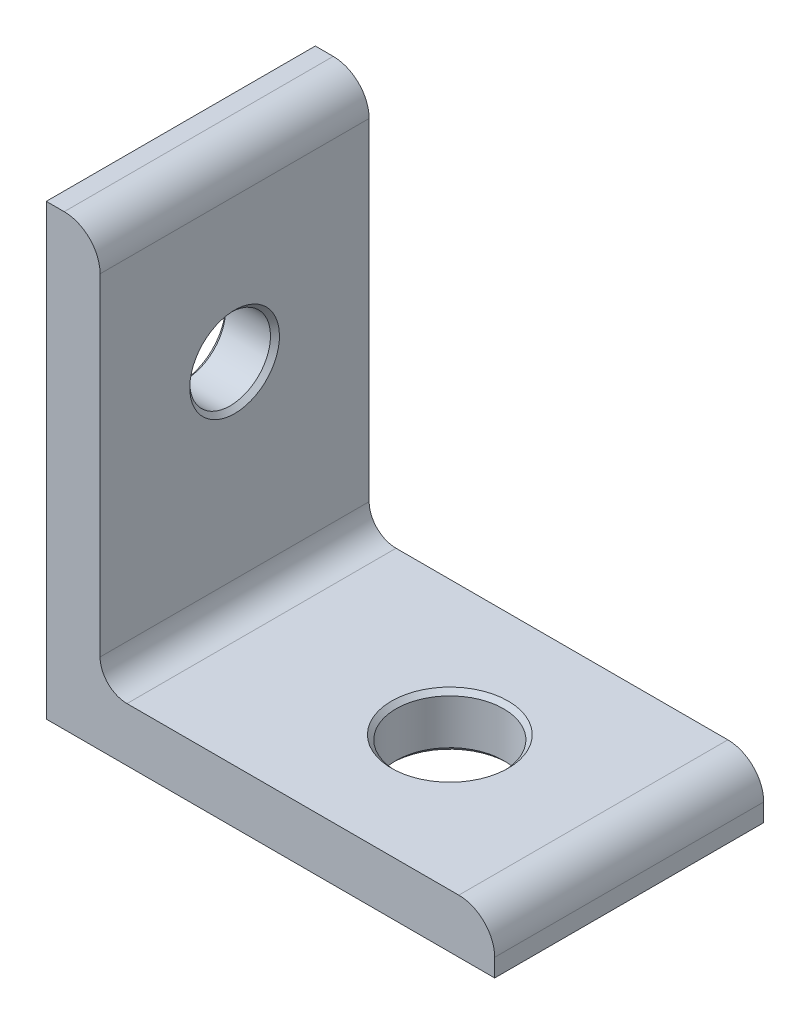
ISO-10303-21;
HEADER;
FILE_DESCRIPTION(('STEP AP214'),'2;1');
FILE_NAME('part.step','',(''),(''),'','','');
FILE_SCHEMA(('AUTOMOTIVE_DESIGN { 1 0 10303 214 1 1 1 1 }'));
ENDSEC;
DATA;
#1=APPLICATION_CONTEXT('core data for automotive mechanical design processes');
#2=APPLICATION_PROTOCOL_DEFINITION('international standard','automotive_design',2000,#1);
#3=PRODUCT_CONTEXT('',#1,'mechanical');
#4=PRODUCT('Part','Part','',(#3));
#5=PRODUCT_RELATED_PRODUCT_CATEGORY('part','',(#4));
#6=PRODUCT_DEFINITION_FORMATION('','',#4);
#7=PRODUCT_DEFINITION_CONTEXT('part definition',#1,'design');
#8=PRODUCT_DEFINITION('design','',#6,#7);
#9=PRODUCT_DEFINITION_SHAPE('','',#8);
#10=(LENGTH_UNIT() NAMED_UNIT(*) SI_UNIT(.MILLI.,.METRE.));
#11=(NAMED_UNIT(*) PLANE_ANGLE_UNIT() SI_UNIT($,.RADIAN.));
#12=(NAMED_UNIT(*) SI_UNIT($,.STERADIAN.) SOLID_ANGLE_UNIT());
#13=UNCERTAINTY_MEASURE_WITH_UNIT(LENGTH_MEASURE(1.E-05),#10,'distance_accuracy_value','');
#14=(GEOMETRIC_REPRESENTATION_CONTEXT(3) GLOBAL_UNCERTAINTY_ASSIGNED_CONTEXT((#13)) GLOBAL_UNIT_ASSIGNED_CONTEXT((#10,
#11,#12)) REPRESENTATION_CONTEXT('',''));
#15=CARTESIAN_POINT('',(0.,0.,0.));
#16=DIRECTION('',(0.,0.,1.));
#17=DIRECTION('',(1.,0.,0.));
#18=AXIS2_PLACEMENT_3D('',#15,#16,#17);
#19=CARTESIAN_POINT('',(0.,0.,-9.5));
#20=DIRECTION('',(0.,-1.,0.));
#21=DIRECTION('',(1.,0.,0.));
#22=AXIS2_PLACEMENT_3D('',#19,#20,#21);
#23=PLANE('',#22);
#24=CARTESIAN_POINT('',(30.,0.,5.5));
#25=DIRECTION('',(0.,-1.,0.));
#26=DIRECTION('',(1.,0.,0.));
#27=AXIS2_PLACEMENT_3D('',#24,#25,#26);
#28=CIRCLE('',#27,6.5);
#29=CARTESIAN_POINT('',(36.5,0.,5.5));
#30=VERTEX_POINT('',#29);
#31=EDGE_CURVE('E159',#30,#30,#28,.F.);
#32=ORIENTED_EDGE('',*,*,#31,.T.);
#33=EDGE_LOOP('',(#32));
#34=FACE_BOUND('',#33,.T.);
#35=DIRECTION('',(1.,0.,0.));
#36=VECTOR('',#35,1.);
#37=CARTESIAN_POINT('',(0.,0.,20.5));
#38=LINE('',#37,#36);
#39=CARTESIAN_POINT('',(0.,0.,20.5));
#40=VERTEX_POINT('',#39);
#41=CARTESIAN_POINT('',(50.,0.,20.5));
#42=VERTEX_POINT('',#41);
#43=EDGE_CURVE('E136',#40,#42,#38,.T.);
#44=ORIENTED_EDGE('',*,*,#43,.F.);
#45=DIRECTION('',(0.,0.,1.));
#46=VECTOR('',#45,1.);
#47=CARTESIAN_POINT('',(0.,0.,-9.5));
#48=LINE('',#47,#46);
#49=CARTESIAN_POINT('',(0.,0.,-9.5));
#50=VERTEX_POINT('',#49);
#51=EDGE_CURVE('E124',#50,#40,#48,.T.);
#52=ORIENTED_EDGE('',*,*,#51,.F.);
#53=DIRECTION('',(1.,0.,0.));
#54=VECTOR('',#53,1.);
#55=CARTESIAN_POINT('',(0.,0.,-9.5));
#56=LINE('',#55,#54);
#57=CARTESIAN_POINT('',(50.,0.,-9.5));
#58=VERTEX_POINT('',#57);
#59=EDGE_CURVE('E120',#50,#58,#56,.T.);
#60=ORIENTED_EDGE('',*,*,#59,.T.);
#61=DIRECTION('',(0.,0.,1.));
#62=VECTOR('',#61,1.);
#63=CARTESIAN_POINT('',(50.,0.,-9.5));
#64=LINE('',#63,#62);
#65=EDGE_CURVE('E104',#58,#42,#64,.T.);
#66=ORIENTED_EDGE('',*,*,#65,.T.);
#67=EDGE_LOOP('',(#44,#52,#60,#66));
#68=FACE_BOUND('',#67,.T.);
#69=ADVANCED_FACE('F34',(#34,#68),#23,.T.);
#70=CARTESIAN_POINT('',(0.,50.,-9.5));
#71=DIRECTION('',(-1.,0.,0.));
#72=DIRECTION('',(0.,0.,1.));
#73=AXIS2_PLACEMENT_3D('',#70,#71,#72);
#74=PLANE('',#73);
#75=CARTESIAN_POINT('',(0.,30.,5.5));
#76=DIRECTION('',(-1.,0.,0.));
#77=DIRECTION('',(0.,0.,1.));
#78=AXIS2_PLACEMENT_3D('',#75,#76,#77);
#79=CIRCLE('',#78,4.99999999999996);
#80=CARTESIAN_POINT('',(0.,30.,10.5));
#81=VERTEX_POINT('',#80);
#82=EDGE_CURVE('E147',#81,#81,#79,.F.);
#83=ORIENTED_EDGE('',*,*,#82,.T.);
#84=EDGE_LOOP('',(#83));
#85=FACE_BOUND('',#84,.T.);
#86=DIRECTION('',(0.,-1.,0.));
#87=VECTOR('',#86,1.);
#88=CARTESIAN_POINT('',(0.,50.,20.5));
#89=LINE('',#88,#87);
#90=CARTESIAN_POINT('',(0.,50.,20.5));
#91=VERTEX_POINT('',#90);
#92=EDGE_CURVE('E125',#91,#40,#89,.T.);
#93=ORIENTED_EDGE('',*,*,#92,.F.);
#94=DIRECTION('',(0.,0.,1.));
#95=VECTOR('',#94,1.);
#96=CARTESIAN_POINT('',(0.,50.,-9.5));
#97=LINE('',#96,#95);
#98=CARTESIAN_POINT('',(0.,50.,-9.5));
#99=VERTEX_POINT('',#98);
#100=EDGE_CURVE('E113',#99,#91,#97,.T.);
#101=ORIENTED_EDGE('',*,*,#100,.F.);
#102=DIRECTION('',(0.,-1.,0.));
#103=VECTOR('',#102,1.);
#104=CARTESIAN_POINT('',(0.,50.,-9.5));
#105=LINE('',#104,#103);
#106=EDGE_CURVE('E114',#99,#50,#105,.T.);
#107=ORIENTED_EDGE('',*,*,#106,.T.);
#108=ORIENTED_EDGE('',*,*,#51,.T.);
#109=EDGE_LOOP('',(#93,#101,#107,#108));
#110=FACE_BOUND('',#109,.T.);
#111=ADVANCED_FACE('F220',(#85,#110),#74,.T.);
#112=CARTESIAN_POINT('',(50.,50.,-9.5));
#113=DIRECTION('',(0.,1.,0.));
#114=DIRECTION('',(0.,0.,1.));
#115=AXIS2_PLACEMENT_3D('',#112,#113,#114);
#116=PLANE('',#115);
#117=DIRECTION('',(-1.,0.,0.));
#118=VECTOR('',#117,1.);
#119=CARTESIAN_POINT('',(50.,50.,20.5));
#120=LINE('',#119,#118);
#121=CARTESIAN_POINT('',(1.99999997999942,50.,20.5));
#122=VERTEX_POINT('',#121);
#123=EDGE_CURVE('E128',#122,#91,#120,.T.);
#124=ORIENTED_EDGE('',*,*,#123,.F.);
#125=DIRECTION('',(0.,0.,1.));
#126=VECTOR('',#125,1.);
#127=CARTESIAN_POINT('',(1.99999997999943,50.,-9.5));
#128=LINE('',#127,#126);
#129=CARTESIAN_POINT('',(1.99999997999942,50.,-9.5));
#130=VERTEX_POINT('',#129);
#131=EDGE_CURVE('E188',#122,#130,#128,.F.);
#132=ORIENTED_EDGE('',*,*,#131,.T.);
#133=DIRECTION('',(-1.,0.,0.));
#134=VECTOR('',#133,1.);
#135=CARTESIAN_POINT('',(50.,50.,-9.5));
#136=LINE('',#135,#134);
#137=EDGE_CURVE('E122',#130,#99,#136,.T.);
#138=ORIENTED_EDGE('',*,*,#137,.T.);
#139=ORIENTED_EDGE('',*,*,#100,.T.);
#140=EDGE_LOOP('',(#124,#132,#138,#139));
#141=FACE_BOUND('',#140,.T.);
#142=ADVANCED_FACE('F226',(#141),#116,.T.);
#143=CARTESIAN_POINT('',(50.,0.,-9.5));
#144=DIRECTION('',(1.,0.,0.));
#145=DIRECTION('',(0.,0.,-1.));
#146=AXIS2_PLACEMENT_3D('',#143,#144,#145);
#147=PLANE('',#146);
#148=DIRECTION('',(0.,1.,0.));
#149=VECTOR('',#148,1.);
#150=CARTESIAN_POINT('',(50.,0.,-9.5));
#151=LINE('',#150,#149);
#152=CARTESIAN_POINT('',(50.,1.99999997999943,-9.5));
#153=VERTEX_POINT('',#152);
#154=EDGE_CURVE('E106',#58,#153,#151,.T.);
#155=ORIENTED_EDGE('',*,*,#154,.T.);
#156=DIRECTION('',(0.,0.,-1.));
#157=VECTOR('',#156,1.);
#158=CARTESIAN_POINT('',(50.,1.99999997999943,20.5));
#159=LINE('',#158,#157);
#160=CARTESIAN_POINT('',(50.,1.99999997999943,20.5));
#161=VERTEX_POINT('',#160);
#162=EDGE_CURVE('E11',#153,#161,#159,.F.);
#163=ORIENTED_EDGE('',*,*,#162,.T.);
#164=DIRECTION('',(0.,1.,0.));
#165=VECTOR('',#164,1.);
#166=CARTESIAN_POINT('',(50.,0.,20.5));
#167=LINE('',#166,#165);
#168=EDGE_CURVE('E108',#42,#161,#167,.T.);
#169=ORIENTED_EDGE('',*,*,#168,.F.);
#170=ORIENTED_EDGE('',*,*,#65,.F.);
#171=EDGE_LOOP('',(#155,#163,#169,#170));
#172=FACE_BOUND('',#171,.T.);
#173=ADVANCED_FACE('F105',(#172),#147,.T.);
#174=CARTESIAN_POINT('',(0.,0.,-9.5));
#175=DIRECTION('',(0.,0.,1.));
#176=DIRECTION('',(1.,0.,0.));
#177=AXIS2_PLACEMENT_3D('',#174,#175,#176);
#178=PLANE('',#177);
#179=ORIENTED_EDGE('',*,*,#137,.F.);
#180=CARTESIAN_POINT('',(1.99999997999943,45.9999999799994,-9.5));
#181=DIRECTION('',(0.,0.,1.));
#182=DIRECTION('',(1.,0.,0.));
#183=AXIS2_PLACEMENT_3D('',#180,#181,#182);
#184=CIRCLE('',#183,4.00000002000058);
#185=CARTESIAN_POINT('',(6.,45.9999999799994,-9.5));
#186=VERTEX_POINT('',#185);
#187=EDGE_CURVE('E191',#130,#186,#184,.F.);
#188=ORIENTED_EDGE('',*,*,#187,.T.);
#189=DIRECTION('',(0.,1.,0.));
#190=VECTOR('',#189,1.);
#191=CARTESIAN_POINT('',(6.,6.,-9.5));
#192=LINE('',#191,#190);
#193=CARTESIAN_POINT('',(6.,9.00000000000015,-9.5));
#194=VERTEX_POINT('',#193);
#195=EDGE_CURVE('E131',#194,#186,#192,.T.);
#196=ORIENTED_EDGE('',*,*,#195,.F.);
#197=CARTESIAN_POINT('',(9.00000000000015,9.00000000000015,-9.5));
#198=DIRECTION('',(0.,0.,1.));
#199=DIRECTION('',(1.,0.,0.));
#200=AXIS2_PLACEMENT_3D('',#197,#198,#199);
#201=CIRCLE('',#200,3.00000000000015);
#202=CARTESIAN_POINT('',(9.00000000000015,6.,-9.5));
#203=VERTEX_POINT('',#202);
#204=EDGE_CURVE('E176',#194,#203,#201,.T.);
#205=ORIENTED_EDGE('',*,*,#204,.T.);
#206=DIRECTION('',(-1.,0.,0.));
#207=VECTOR('',#206,1.);
#208=CARTESIAN_POINT('',(90.,6.,-9.5));
#209=LINE('',#208,#207);
#210=CARTESIAN_POINT('',(45.9999999799994,6.,-9.5));
#211=VERTEX_POINT('',#210);
#212=EDGE_CURVE('E194',#211,#203,#209,.T.);
#213=ORIENTED_EDGE('',*,*,#212,.F.);
#214=CARTESIAN_POINT('',(45.9999999799994,1.99999997999943,-9.5));
#215=DIRECTION('',(0.,0.,1.));
#216=DIRECTION('',(1.,0.,0.));
#217=AXIS2_PLACEMENT_3D('',#214,#215,#216);
#218=CIRCLE('',#217,4.00000002000058);
#219=EDGE_CURVE('E49',#211,#153,#218,.F.);
#220=ORIENTED_EDGE('',*,*,#219,.T.);
#221=ORIENTED_EDGE('',*,*,#154,.F.);
#222=ORIENTED_EDGE('',*,*,#59,.F.);
#223=ORIENTED_EDGE('',*,*,#106,.F.);
#224=EDGE_LOOP('',(#179,#188,#196,#205,#213,#220,#221,#222,#223));
#225=FACE_BOUND('',#224,.T.);
#226=ADVANCED_FACE('F118',(#225),#178,.F.);
#227=CARTESIAN_POINT('',(0.,0.,20.5));
#228=DIRECTION('',(0.,0.,1.));
#229=DIRECTION('',(1.,0.,0.));
#230=AXIS2_PLACEMENT_3D('',#227,#228,#229);
#231=PLANE('',#230);
#232=DIRECTION('',(0.,1.,0.));
#233=VECTOR('',#232,1.);
#234=CARTESIAN_POINT('',(6.,6.,20.5));
#235=LINE('',#234,#233);
#236=CARTESIAN_POINT('',(6.,9.00000000000015,20.5));
#237=VERTEX_POINT('',#236);
#238=CARTESIAN_POINT('',(6.,45.9999999799994,20.5));
#239=VERTEX_POINT('',#238);
#240=EDGE_CURVE('E138',#237,#239,#235,.T.);
#241=ORIENTED_EDGE('',*,*,#240,.T.);
#242=CARTESIAN_POINT('',(1.99999997999943,45.9999999799994,20.5));
#243=DIRECTION('',(0.,0.,1.));
#244=DIRECTION('',(1.,0.,0.));
#245=AXIS2_PLACEMENT_3D('',#242,#243,#244);
#246=CIRCLE('',#245,4.00000002000058);
#247=EDGE_CURVE('E186',#239,#122,#246,.T.);
#248=ORIENTED_EDGE('',*,*,#247,.T.);
#249=ORIENTED_EDGE('',*,*,#123,.T.);
#250=ORIENTED_EDGE('',*,*,#92,.T.);
#251=ORIENTED_EDGE('',*,*,#43,.T.);
#252=ORIENTED_EDGE('',*,*,#168,.T.);
#253=CARTESIAN_POINT('',(45.9999999799994,1.99999997999943,20.5));
#254=DIRECTION('',(0.,0.,1.));
#255=DIRECTION('',(1.,0.,0.));
#256=AXIS2_PLACEMENT_3D('',#253,#254,#255);
#257=CIRCLE('',#256,4.00000002000058);
#258=CARTESIAN_POINT('',(45.9999999799994,6.,20.5));
#259=VERTEX_POINT('',#258);
#260=EDGE_CURVE('E184',#161,#259,#257,.T.);
#261=ORIENTED_EDGE('',*,*,#260,.T.);
#262=DIRECTION('',(1.,0.,0.));
#263=VECTOR('',#262,1.);
#264=CARTESIAN_POINT('',(0.,6.,20.5));
#265=LINE('',#264,#263);
#266=CARTESIAN_POINT('',(9.00000000000015,6.,20.5));
#267=VERTEX_POINT('',#266);
#268=EDGE_CURVE('E142',#267,#259,#265,.T.);
#269=ORIENTED_EDGE('',*,*,#268,.F.);
#270=CARTESIAN_POINT('',(9.00000000000015,9.00000000000015,20.5));
#271=DIRECTION('',(0.,0.,1.));
#272=DIRECTION('',(1.,0.,0.));
#273=AXIS2_PLACEMENT_3D('',#270,#271,#272);
#274=CIRCLE('',#273,3.00000000000015);
#275=EDGE_CURVE('E179',#267,#237,#274,.F.);
#276=ORIENTED_EDGE('',*,*,#275,.T.);
#277=EDGE_LOOP('',(#241,#248,#249,#250,#251,#252,#261,#269,#276));
#278=FACE_BOUND('',#277,.T.);
#279=ADVANCED_FACE('F204',(#278),#231,.T.);
#280=CARTESIAN_POINT('',(90.,6.,20.5));
#281=DIRECTION('',(0.,-1.,0.));
#282=DIRECTION('',(0.,0.,-1.));
#283=AXIS2_PLACEMENT_3D('',#280,#281,#282);
#284=PLANE('',#283);
#285=CARTESIAN_POINT('',(30.,6.,5.5));
#286=DIRECTION('',(0.,-1.,0.));
#287=DIRECTION('',(0.,0.,-1.));
#288=AXIS2_PLACEMENT_3D('',#285,#286,#287);
#289=CIRCLE('',#288,6.49999999999998);
#290=CARTESIAN_POINT('',(30.,6.,-0.999999999999984));
#291=VERTEX_POINT('',#290);
#292=EDGE_CURVE('E168',#291,#291,#289,.T.);
#293=ORIENTED_EDGE('',*,*,#292,.T.);
#294=EDGE_LOOP('',(#293));
#295=FACE_BOUND('',#294,.T.);
#296=ORIENTED_EDGE('',*,*,#268,.T.);
#297=DIRECTION('',(0.,0.,-1.));
#298=VECTOR('',#297,1.);
#299=CARTESIAN_POINT('',(45.9999999799994,6.,-9.5));
#300=LINE('',#299,#298);
#301=EDGE_CURVE('E42',#259,#211,#300,.T.);
#302=ORIENTED_EDGE('',*,*,#301,.T.);
#303=ORIENTED_EDGE('',*,*,#212,.T.);
#304=DIRECTION('',(0.,0.,-1.));
#305=VECTOR('',#304,1.);
#306=CARTESIAN_POINT('',(9.00000000000015,6.,20.5));
#307=LINE('',#306,#305);
#308=EDGE_CURVE('E174',#203,#267,#307,.F.);
#309=ORIENTED_EDGE('',*,*,#308,.T.);
#310=EDGE_LOOP('',(#296,#302,#303,#309));
#311=FACE_BOUND('',#310,.T.);
#312=ADVANCED_FACE('F193',(#295,#311),#284,.F.);
#313=CARTESIAN_POINT('',(6.,6.,20.5));
#314=DIRECTION('',(-1.,0.,0.));
#315=DIRECTION('',(0.,-1.,0.));
#316=AXIS2_PLACEMENT_3D('',#313,#314,#315);
#317=PLANE('',#316);
#318=CARTESIAN_POINT('',(6.,30.,5.5));
#319=DIRECTION('',(-1.,0.,0.));
#320=DIRECTION('',(0.,-1.,0.));
#321=AXIS2_PLACEMENT_3D('',#318,#319,#320);
#322=CIRCLE('',#321,4.99999999999998);
#323=CARTESIAN_POINT('',(6.,25.,5.5));
#324=VERTEX_POINT('',#323);
#325=EDGE_CURVE('E156',#324,#324,#322,.T.);
#326=ORIENTED_EDGE('',*,*,#325,.T.);
#327=EDGE_LOOP('',(#326));
#328=FACE_BOUND('',#327,.T.);
#329=ORIENTED_EDGE('',*,*,#195,.T.);
#330=DIRECTION('',(0.,0.,1.));
#331=VECTOR('',#330,1.);
#332=CARTESIAN_POINT('',(6.,45.9999999799994,20.5));
#333=LINE('',#332,#331);
#334=EDGE_CURVE('E181',#186,#239,#333,.T.);
#335=ORIENTED_EDGE('',*,*,#334,.T.);
#336=ORIENTED_EDGE('',*,*,#240,.F.);
#337=DIRECTION('',(0.,0.,-1.));
#338=VECTOR('',#337,1.);
#339=CARTESIAN_POINT('',(6.,9.00000000000015,-9.5));
#340=LINE('',#339,#338);
#341=EDGE_CURVE('E171',#237,#194,#340,.T.);
#342=ORIENTED_EDGE('',*,*,#341,.T.);
#343=EDGE_LOOP('',(#329,#335,#336,#342));
#344=FACE_BOUND('',#343,.T.);
#345=ADVANCED_FACE('F209',(#328,#344),#317,.F.);
#346=CARTESIAN_POINT('',(30.,6.,5.5));
#347=DIRECTION('',(0.,1.,0.));
#348=DIRECTION('',(0.,0.,1.));
#349=AXIS2_PLACEMENT_3D('',#346,#347,#348);
#350=CYLINDRICAL_SURFACE('',#349,6.);
#351=CARTESIAN_POINT('',(30.,0.500000000000002,5.5));
#352=DIRECTION('',(0.,-1.,0.));
#353=DIRECTION('',(0.,0.,-1.));
#354=AXIS2_PLACEMENT_3D('',#351,#352,#353);
#355=CIRCLE('',#354,6.);
#356=CARTESIAN_POINT('',(30.,0.500000000000002,-0.499999999999997));
#357=VERTEX_POINT('',#356);
#358=EDGE_CURVE('E165',#357,#357,#355,.T.);
#359=ORIENTED_EDGE('',*,*,#358,.T.);
#360=EDGE_LOOP('',(#359));
#361=FACE_BOUND('',#360,.T.);
#362=CARTESIAN_POINT('',(30.,5.50000000000002,5.5));
#363=DIRECTION('',(0.,-1.,0.));
#364=DIRECTION('',(0.,0.,-1.));
#365=AXIS2_PLACEMENT_3D('',#362,#363,#364);
#366=CIRCLE('',#365,6.);
#367=CARTESIAN_POINT('',(30.,5.50000000000002,-0.499999999999997));
#368=VERTEX_POINT('',#367);
#369=EDGE_CURVE('E162',#368,#368,#366,.F.);
#370=ORIENTED_EDGE('',*,*,#369,.T.);
#371=EDGE_LOOP('',(#370));
#372=FACE_BOUND('',#371,.T.);
#373=ADVANCED_FACE('F272',(#361,#372),#350,.F.);
#374=CARTESIAN_POINT('',(6.,30.,5.5));
#375=DIRECTION('',(1.,0.,0.));
#376=DIRECTION('',(0.,0.,-1.));
#377=AXIS2_PLACEMENT_3D('',#374,#375,#376);
#378=CYLINDRICAL_SURFACE('',#377,4.49999999999999);
#379=CARTESIAN_POINT('',(0.49999999999998,30.,5.5));
#380=DIRECTION('',(-1.,0.,0.));
#381=DIRECTION('',(0.,0.,1.));
#382=AXIS2_PLACEMENT_3D('',#379,#380,#381);
#383=CIRCLE('',#382,4.49999999999999);
#384=CARTESIAN_POINT('',(0.49999999999998,30.,9.99999999999999));
#385=VERTEX_POINT('',#384);
#386=EDGE_CURVE('E153',#385,#385,#383,.T.);
#387=ORIENTED_EDGE('',*,*,#386,.T.);
#388=EDGE_LOOP('',(#387));
#389=FACE_BOUND('',#388,.T.);
#390=CARTESIAN_POINT('',(5.50000000000002,30.,5.5));
#391=DIRECTION('',(-1.,0.,0.));
#392=DIRECTION('',(0.,0.,1.));
#393=AXIS2_PLACEMENT_3D('',#390,#391,#392);
#394=CIRCLE('',#393,4.49999999999999);
#395=CARTESIAN_POINT('',(5.50000000000002,30.,9.99999999999999));
#396=VERTEX_POINT('',#395);
#397=EDGE_CURVE('E150',#396,#396,#394,.F.);
#398=ORIENTED_EDGE('',*,*,#397,.T.);
#399=EDGE_LOOP('',(#398));
#400=FACE_BOUND('',#399,.T.);
#401=ADVANCED_FACE('F236',(#389,#400),#378,.F.);
#402=CARTESIAN_POINT('',(0.,30.,5.5));
#403=DIRECTION('',(-1.,0.,0.));
#404=DIRECTION('',(0.,0.,1.));
#405=AXIS2_PLACEMENT_3D('',#402,#403,#404);
#406=CONICAL_SURFACE('',#405,4.99999999999996,0.785398163397445);
#407=ORIENTED_EDGE('',*,*,#386,.F.);
#408=EDGE_LOOP('',(#407));
#409=FACE_BOUND('',#408,.T.);
#410=ORIENTED_EDGE('',*,*,#82,.F.);
#411=EDGE_LOOP('',(#410));
#412=FACE_BOUND('',#411,.T.);
#413=ADVANCED_FACE('F232',(#409,#412),#406,.F.);
#414=CARTESIAN_POINT('',(5.50000000000002,30.,5.5));
#415=DIRECTION('',(1.,0.,0.));
#416=DIRECTION('',(0.,0.,-1.));
#417=AXIS2_PLACEMENT_3D('',#414,#415,#416);
#418=CONICAL_SURFACE('',#417,4.49999999999999,0.785398163397452);
#419=ORIENTED_EDGE('',*,*,#325,.F.);
#420=EDGE_LOOP('',(#419));
#421=FACE_BOUND('',#420,.T.);
#422=ORIENTED_EDGE('',*,*,#397,.F.);
#423=EDGE_LOOP('',(#422));
#424=FACE_BOUND('',#423,.T.);
#425=ADVANCED_FACE('F235',(#421,#424),#418,.F.);
#426=CARTESIAN_POINT('',(30.,0.,5.5));
#427=DIRECTION('',(0.,-1.,0.));
#428=DIRECTION('',(0.,0.,-1.));
#429=AXIS2_PLACEMENT_3D('',#426,#427,#428);
#430=CONICAL_SURFACE('',#429,6.5,0.785398163397449);
#431=ORIENTED_EDGE('',*,*,#358,.F.);
#432=EDGE_LOOP('',(#431));
#433=FACE_BOUND('',#432,.T.);
#434=ORIENTED_EDGE('',*,*,#31,.F.);
#435=EDGE_LOOP('',(#434));
#436=FACE_BOUND('',#435,.T.);
#437=ADVANCED_FACE('F240',(#433,#436),#430,.F.);
#438=CARTESIAN_POINT('',(30.,5.50000000000002,5.5));
#439=DIRECTION('',(0.,1.,0.));
#440=DIRECTION('',(0.,0.,1.));
#441=AXIS2_PLACEMENT_3D('',#438,#439,#440);
#442=CONICAL_SURFACE('',#441,6.,0.785398163397456);
#443=ORIENTED_EDGE('',*,*,#292,.F.);
#444=EDGE_LOOP('',(#443));
#445=FACE_BOUND('',#444,.T.);
#446=ORIENTED_EDGE('',*,*,#369,.F.);
#447=EDGE_LOOP('',(#446));
#448=FACE_BOUND('',#447,.T.);
#449=ADVANCED_FACE('F244',(#445,#448),#442,.F.);
#450=CARTESIAN_POINT('',(9.00000000000015,9.00000000000015,20.5));
#451=DIRECTION('',(0.,0.,1.));
#452=DIRECTION('',(1.,0.,0.));
#453=AXIS2_PLACEMENT_3D('',#450,#451,#452);
#454=CYLINDRICAL_SURFACE('',#453,3.00000000000015);
#455=ORIENTED_EDGE('',*,*,#275,.F.);
#456=ORIENTED_EDGE('',*,*,#308,.F.);
#457=ORIENTED_EDGE('',*,*,#204,.F.);
#458=ORIENTED_EDGE('',*,*,#341,.F.);
#459=EDGE_LOOP('',(#455,#456,#457,#458));
#460=FACE_BOUND('',#459,.T.);
#461=ADVANCED_FACE('F212',(#460),#454,.F.);
#462=CARTESIAN_POINT('',(1.99999997999943,45.9999999799994,20.5));
#463=DIRECTION('',(0.,0.,-1.));
#464=DIRECTION('',(-1.,0.,0.));
#465=AXIS2_PLACEMENT_3D('',#462,#463,#464);
#466=CYLINDRICAL_SURFACE('',#465,4.00000002000058);
#467=ORIENTED_EDGE('',*,*,#187,.F.);
#468=ORIENTED_EDGE('',*,*,#131,.F.);
#469=ORIENTED_EDGE('',*,*,#247,.F.);
#470=ORIENTED_EDGE('',*,*,#334,.F.);
#471=EDGE_LOOP('',(#467,#468,#469,#470));
#472=FACE_BOUND('',#471,.T.);
#473=ADVANCED_FACE('F214',(#472),#466,.T.);
#474=CARTESIAN_POINT('',(45.9999999799994,1.99999997999943,20.5));
#475=DIRECTION('',(0.,0.,1.));
#476=DIRECTION('',(1.,0.,0.));
#477=AXIS2_PLACEMENT_3D('',#474,#475,#476);
#478=CYLINDRICAL_SURFACE('',#477,4.00000002000058);
#479=ORIENTED_EDGE('',*,*,#260,.F.);
#480=ORIENTED_EDGE('',*,*,#162,.F.);
#481=ORIENTED_EDGE('',*,*,#219,.F.);
#482=ORIENTED_EDGE('',*,*,#301,.F.);
#483=EDGE_LOOP('',(#479,#480,#481,#482));
#484=FACE_BOUND('',#483,.T.);
#485=ADVANCED_FACE('F36',(#484),#478,.T.);
#486=CLOSED_SHELL('',(#69,#111,#142,#173,#226,#279,#312,#345,#373,#401,#413,#425,#437,#449,#461,
#473,#485));
#487=MANIFOLD_SOLID_BREP('B2',#486);
#488=ADVANCED_BREP_SHAPE_REPRESENTATION('',(#18,#487),#14);
#489=SHAPE_DEFINITION_REPRESENTATION(#9,#488);
ENDSEC;
END-ISO-10303-21;
